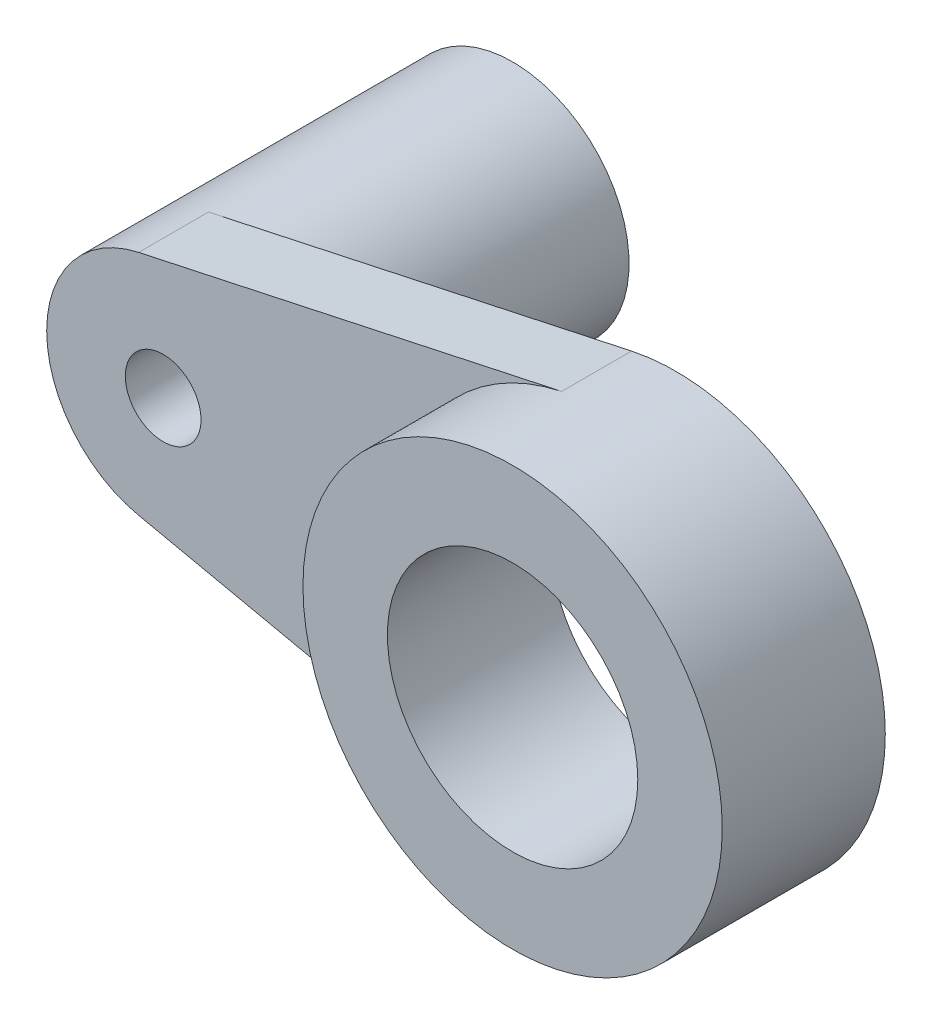
ISO-10303-21;
HEADER;
FILE_DESCRIPTION(('STEP AP214'),'2;1');
FILE_NAME('part.step','',(''),(''),'','','');
FILE_SCHEMA(('AUTOMOTIVE_DESIGN { 1 0 10303 214 1 1 1 1 }'));
ENDSEC;
DATA;
#1=APPLICATION_CONTEXT('core data for automotive mechanical design processes');
#2=APPLICATION_PROTOCOL_DEFINITION('international standard','automotive_design',2000,#1);
#3=PRODUCT_CONTEXT('',#1,'mechanical');
#4=PRODUCT('Part','Part','',(#3));
#5=PRODUCT_RELATED_PRODUCT_CATEGORY('part','',(#4));
#6=PRODUCT_DEFINITION_FORMATION('','',#4);
#7=PRODUCT_DEFINITION_CONTEXT('part definition',#1,'design');
#8=PRODUCT_DEFINITION('design','',#6,#7);
#9=PRODUCT_DEFINITION_SHAPE('','',#8);
#10=(LENGTH_UNIT() NAMED_UNIT(*) SI_UNIT(.MILLI.,.METRE.));
#11=(NAMED_UNIT(*) PLANE_ANGLE_UNIT() SI_UNIT($,.RADIAN.));
#12=(NAMED_UNIT(*) SI_UNIT($,.STERADIAN.) SOLID_ANGLE_UNIT());
#13=UNCERTAINTY_MEASURE_WITH_UNIT(LENGTH_MEASURE(1.E-05),#10,'distance_accuracy_value','');
#14=(GEOMETRIC_REPRESENTATION_CONTEXT(3) GLOBAL_UNCERTAINTY_ASSIGNED_CONTEXT((#13)) GLOBAL_UNIT_ASSIGNED_CONTEXT((#10,
#11,#12)) REPRESENTATION_CONTEXT('',''));
#15=CARTESIAN_POINT('',(0.,0.,0.));
#16=DIRECTION('',(0.,0.,1.));
#17=DIRECTION('',(1.,0.,0.));
#18=AXIS2_PLACEMENT_3D('',#15,#16,#17);
#19=CARTESIAN_POINT('',(0.,0.,0.));
#20=DIRECTION('',(0.,0.,1.));
#21=DIRECTION('',(1.,0.,0.));
#22=AXIS2_PLACEMENT_3D('',#19,#20,#21);
#23=PLANE('',#22);
#24=CARTESIAN_POINT('',(0.,0.,0.));
#25=DIRECTION('',(0.,0.,1.));
#26=DIRECTION('',(1.,0.,0.));
#27=AXIS2_PLACEMENT_3D('',#24,#25,#26);
#28=CIRCLE('',#27,10.75);
#29=CARTESIAN_POINT('',(10.75,0.,0.));
#30=VERTEX_POINT('',#29);
#31=EDGE_CURVE('E148',#30,#30,#28,.T.);
#32=ORIENTED_EDGE('',*,*,#31,.T.);
#33=EDGE_LOOP('',(#32));
#34=FACE_BOUND('',#33,.T.);
#35=CARTESIAN_POINT('',(-38.,0.,0.));
#36=DIRECTION('',(0.,0.,-1.));
#37=DIRECTION('',(-1.,0.,0.));
#38=AXIS2_PLACEMENT_3D('',#35,#36,#37);
#39=CIRCLE('',#38,10.);
#40=CARTESIAN_POINT('',(-40.1052631578947,9.77588190579301,0.));
#41=VERTEX_POINT('',#40);
#42=CARTESIAN_POINT('',(-40.1052631578947,-9.77588190579301,0.));
#43=VERTEX_POINT('',#42);
#44=EDGE_CURVE('E110',#41,#43,#39,.T.);
#45=ORIENTED_EDGE('',*,*,#44,.F.);
#46=DIRECTION('',(0.977588190579301,0.210526315789474,0.));
#47=VECTOR('',#46,1.);
#48=CARTESIAN_POINT('',(-3.78947368421052,17.5965874304274,0.));
#49=LINE('',#48,#47);
#50=CARTESIAN_POINT('',(-3.78947368421053,17.5965874304274,0.));
#51=VERTEX_POINT('',#50);
#52=EDGE_CURVE('E93',#41,#51,#49,.T.);
#53=ORIENTED_EDGE('',*,*,#52,.T.);
#54=CARTESIAN_POINT('',(0.,0.,0.));
#55=DIRECTION('',(0.,0.,1.));
#56=DIRECTION('',(1.,0.,0.));
#57=AXIS2_PLACEMENT_3D('',#54,#55,#56);
#58=CIRCLE('',#57,18.);
#59=CARTESIAN_POINT('',(-3.78947368421053,-17.5965874304274,0.));
#60=VERTEX_POINT('',#59);
#61=EDGE_CURVE('E57',#60,#51,#58,.T.);
#62=ORIENTED_EDGE('',*,*,#61,.F.);
#63=DIRECTION('',(-0.977588190579301,0.210526315789474,0.));
#64=VECTOR('',#63,1.);
#65=CARTESIAN_POINT('',(-3.78947368421052,-17.5965874304274,0.));
#66=LINE('',#65,#64);
#67=EDGE_CURVE('E103',#60,#43,#66,.T.);
#68=ORIENTED_EDGE('',*,*,#67,.T.);
#69=EDGE_LOOP('',(#45,#53,#62,#68));
#70=FACE_BOUND('',#69,.T.);
#71=ADVANCED_FACE('F53',(#34,#70),#23,.F.);
#72=CARTESIAN_POINT('',(0.,0.,14.));
#73=DIRECTION('',(0.,0.,1.));
#74=DIRECTION('',(1.,0.,0.));
#75=AXIS2_PLACEMENT_3D('',#72,#73,#74);
#76=PLANE('',#75);
#77=CARTESIAN_POINT('',(0.,0.,14.));
#78=DIRECTION('',(0.,0.,1.));
#79=DIRECTION('',(1.,0.,0.));
#80=AXIS2_PLACEMENT_3D('',#77,#78,#79);
#81=CIRCLE('',#80,18.);
#82=CARTESIAN_POINT('',(18.,0.,14.));
#83=VERTEX_POINT('',#82);
#84=EDGE_CURVE('E12',#83,#83,#81,.T.);
#85=ORIENTED_EDGE('',*,*,#84,.T.);
#86=EDGE_LOOP('',(#85));
#87=FACE_BOUND('',#86,.T.);
#88=CARTESIAN_POINT('',(0.,0.,14.));
#89=DIRECTION('',(0.,0.,1.));
#90=DIRECTION('',(1.,0.,0.));
#91=AXIS2_PLACEMENT_3D('',#88,#89,#90);
#92=CIRCLE('',#91,10.75);
#93=CARTESIAN_POINT('',(10.75,0.,14.));
#94=VERTEX_POINT('',#93);
#95=EDGE_CURVE('E153',#94,#94,#92,.T.);
#96=ORIENTED_EDGE('',*,*,#95,.F.);
#97=EDGE_LOOP('',(#96));
#98=FACE_BOUND('',#97,.T.);
#99=ADVANCED_FACE('F174',(#87,#98),#76,.T.);
#100=CARTESIAN_POINT('',(0.,0.,14.));
#101=DIRECTION('',(0.,0.,-1.));
#102=DIRECTION('',(-1.,0.,0.));
#103=AXIS2_PLACEMENT_3D('',#100,#101,#102);
#104=CYLINDRICAL_SURFACE('',#103,18.);
#105=CARTESIAN_POINT('',(0.,0.,6.));
#106=DIRECTION('',(0.,0.,-1.));
#107=DIRECTION('',(-1.,0.,0.));
#108=AXIS2_PLACEMENT_3D('',#105,#106,#107);
#109=CIRCLE('',#108,18.);
#110=CARTESIAN_POINT('',(-3.78947368421053,-17.5965874304274,6.));
#111=VERTEX_POINT('',#110);
#112=CARTESIAN_POINT('',(-3.78947368421053,17.5965874304274,6.));
#113=VERTEX_POINT('',#112);
#114=EDGE_CURVE('E73',#111,#113,#109,.T.);
#115=ORIENTED_EDGE('',*,*,#114,.F.);
#116=DIRECTION('',(0.,0.,-1.));
#117=VECTOR('',#116,1.);
#118=CARTESIAN_POINT('',(-3.78947368421053,-17.5965874304274,6.));
#119=LINE('',#118,#117);
#120=EDGE_CURVE('E145',#111,#60,#119,.T.);
#121=ORIENTED_EDGE('',*,*,#120,.T.);
#122=ORIENTED_EDGE('',*,*,#61,.T.);
#123=DIRECTION('',(0.,0.,-1.));
#124=VECTOR('',#123,1.);
#125=CARTESIAN_POINT('',(-3.78947368421053,17.5965874304274,6.));
#126=LINE('',#125,#124);
#127=EDGE_CURVE('E69',#113,#51,#126,.T.);
#128=ORIENTED_EDGE('',*,*,#127,.F.);
#129=EDGE_LOOP('',(#115,#121,#122,#128));
#130=FACE_BOUND('',#129,.T.);
#131=ORIENTED_EDGE('',*,*,#84,.F.);
#132=EDGE_LOOP('',(#131));
#133=FACE_BOUND('',#132,.T.);
#134=ADVANCED_FACE('F55',(#130,#133),#104,.T.);
#135=CARTESIAN_POINT('',(0.,0.,14.));
#136=DIRECTION('',(0.,0.,-1.));
#137=DIRECTION('',(-1.,0.,0.));
#138=AXIS2_PLACEMENT_3D('',#135,#136,#137);
#139=CYLINDRICAL_SURFACE('',#138,10.75);
#140=ORIENTED_EDGE('',*,*,#95,.T.);
#141=EDGE_LOOP('',(#140));
#142=FACE_BOUND('',#141,.T.);
#143=ORIENTED_EDGE('',*,*,#31,.F.);
#144=EDGE_LOOP('',(#143));
#145=FACE_BOUND('',#144,.T.);
#146=ADVANCED_FACE('F162',(#142,#145),#139,.F.);
#147=CARTESIAN_POINT('',(-3.78947368421052,-17.5965874304274,6.));
#148=DIRECTION('',(-0.210526315789474,-0.977588190579301,0.));
#149=DIRECTION('',(0.977588190579301,-0.210526315789474,0.));
#150=AXIS2_PLACEMENT_3D('',#147,#148,#149);
#151=PLANE('',#150);
#152=ORIENTED_EDGE('',*,*,#67,.F.);
#153=ORIENTED_EDGE('',*,*,#120,.F.);
#154=DIRECTION('',(-0.977588190579301,0.210526315789474,0.));
#155=VECTOR('',#154,1.);
#156=CARTESIAN_POINT('',(-3.78947368421052,-17.5965874304274,6.));
#157=LINE('',#156,#155);
#158=CARTESIAN_POINT('',(-40.1052631578947,-9.77588190579301,6.));
#159=VERTEX_POINT('',#158);
#160=EDGE_CURVE('E132',#111,#159,#157,.T.);
#161=ORIENTED_EDGE('',*,*,#160,.T.);
#162=DIRECTION('',(0.,0.,-1.));
#163=VECTOR('',#162,1.);
#164=CARTESIAN_POINT('',(-40.1052631578947,-9.77588190579301,6.));
#165=LINE('',#164,#163);
#166=EDGE_CURVE('E114',#159,#43,#165,.T.);
#167=ORIENTED_EDGE('',*,*,#166,.T.);
#168=EDGE_LOOP('',(#152,#153,#161,#167));
#169=FACE_BOUND('',#168,.T.);
#170=ADVANCED_FACE('F164',(#169),#151,.T.);
#171=CARTESIAN_POINT('',(-3.78947368421052,17.5965874304274,6.));
#172=DIRECTION('',(-0.210526315789474,0.977588190579301,0.));
#173=DIRECTION('',(-0.977588190579301,-0.210526315789474,0.));
#174=AXIS2_PLACEMENT_3D('',#171,#172,#173);
#175=PLANE('',#174);
#176=ORIENTED_EDGE('',*,*,#52,.F.);
#177=DIRECTION('',(0.,0.,-1.));
#178=VECTOR('',#177,1.);
#179=CARTESIAN_POINT('',(-40.1052631578947,9.775881905793,6.));
#180=LINE('',#179,#178);
#181=CARTESIAN_POINT('',(-40.1052631578947,9.775881905793,6.));
#182=VERTEX_POINT('',#181);
#183=EDGE_CURVE('E97',#182,#41,#180,.T.);
#184=ORIENTED_EDGE('',*,*,#183,.F.);
#185=DIRECTION('',(0.977588190579301,0.210526315789474,0.));
#186=VECTOR('',#185,1.);
#187=CARTESIAN_POINT('',(-3.78947368421052,17.5965874304274,6.));
#188=LINE('',#187,#186);
#189=EDGE_CURVE('E138',#182,#113,#188,.T.);
#190=ORIENTED_EDGE('',*,*,#189,.T.);
#191=ORIENTED_EDGE('',*,*,#127,.T.);
#192=EDGE_LOOP('',(#176,#184,#190,#191));
#193=FACE_BOUND('',#192,.T.);
#194=ADVANCED_FACE('F95',(#193),#175,.T.);
#195=CARTESIAN_POINT('',(-38.,0.,6.));
#196=DIRECTION('',(0.,0.,-1.));
#197=DIRECTION('',(-1.,0.,0.));
#198=AXIS2_PLACEMENT_3D('',#195,#196,#197);
#199=CYLINDRICAL_SURFACE('',#198,3.25);
#200=CARTESIAN_POINT('',(-38.,0.,6.));
#201=DIRECTION('',(0.,0.,-1.));
#202=DIRECTION('',(-1.,0.,0.));
#203=AXIS2_PLACEMENT_3D('',#200,#201,#202);
#204=CIRCLE('',#203,3.25);
#205=CARTESIAN_POINT('',(-41.25,0.,6.));
#206=VERTEX_POINT('',#205);
#207=EDGE_CURVE('E102',#206,#206,#204,.T.);
#208=ORIENTED_EDGE('',*,*,#207,.F.);
#209=EDGE_LOOP('',(#208));
#210=FACE_BOUND('',#209,.T.);
#211=CARTESIAN_POINT('',(-38.,0.,-24.));
#212=DIRECTION('',(0.,0.,-1.));
#213=DIRECTION('',(-1.,0.,0.));
#214=AXIS2_PLACEMENT_3D('',#211,#212,#213);
#215=CIRCLE('',#214,3.25);
#216=CARTESIAN_POINT('',(-41.25,0.,-24.));
#217=VERTEX_POINT('',#216);
#218=EDGE_CURVE('E120',#217,#217,#215,.T.);
#219=ORIENTED_EDGE('',*,*,#218,.T.);
#220=EDGE_LOOP('',(#219));
#221=FACE_BOUND('',#220,.T.);
#222=ADVANCED_FACE('F215',(#210,#221),#199,.F.);
#223=CARTESIAN_POINT('',(-38.,0.,6.));
#224=DIRECTION('',(0.,0.,-1.));
#225=DIRECTION('',(-1.,0.,0.));
#226=AXIS2_PLACEMENT_3D('',#223,#224,#225);
#227=CYLINDRICAL_SURFACE('',#226,10.);
#228=ORIENTED_EDGE('',*,*,#183,.T.);
#229=ORIENTED_EDGE('',*,*,#44,.T.);
#230=ORIENTED_EDGE('',*,*,#166,.F.);
#231=CARTESIAN_POINT('',(-38.,0.,6.));
#232=DIRECTION('',(0.,0.,-1.));
#233=DIRECTION('',(-1.,0.,0.));
#234=AXIS2_PLACEMENT_3D('',#231,#232,#233);
#235=CIRCLE('',#234,10.);
#236=EDGE_CURVE('E112',#159,#182,#235,.T.);
#237=ORIENTED_EDGE('',*,*,#236,.T.);
#238=EDGE_LOOP('',(#228,#229,#230,#237));
#239=FACE_BOUND('',#238,.T.);
#240=CARTESIAN_POINT('',(-38.,0.,-24.));
#241=DIRECTION('',(0.,0.,-1.));
#242=DIRECTION('',(-1.,0.,0.));
#243=AXIS2_PLACEMENT_3D('',#240,#241,#242);
#244=CIRCLE('',#243,10.);
#245=CARTESIAN_POINT('',(-48.,0.,-24.));
#246=VERTEX_POINT('',#245);
#247=EDGE_CURVE('E119',#246,#246,#244,.T.);
#248=ORIENTED_EDGE('',*,*,#247,.F.);
#249=EDGE_LOOP('',(#248));
#250=FACE_BOUND('',#249,.T.);
#251=ADVANCED_FACE('F108',(#239,#250),#227,.T.);
#252=CARTESIAN_POINT('',(0.,0.,6.));
#253=DIRECTION('',(0.,0.,-1.));
#254=DIRECTION('',(-1.,0.,0.));
#255=AXIS2_PLACEMENT_3D('',#252,#253,#254);
#256=PLANE('',#255);
#257=ORIENTED_EDGE('',*,*,#207,.T.);
#258=EDGE_LOOP('',(#257));
#259=FACE_BOUND('',#258,.T.);
#260=ORIENTED_EDGE('',*,*,#160,.F.);
#261=ORIENTED_EDGE('',*,*,#114,.T.);
#262=ORIENTED_EDGE('',*,*,#189,.F.);
#263=ORIENTED_EDGE('',*,*,#236,.F.);
#264=EDGE_LOOP('',(#260,#261,#262,#263));
#265=FACE_BOUND('',#264,.T.);
#266=ADVANCED_FACE('F235',(#259,#265),#256,.F.);
#267=CARTESIAN_POINT('',(-38.,0.,-24.));
#268=DIRECTION('',(0.,0.,-1.));
#269=DIRECTION('',(-1.,0.,0.));
#270=AXIS2_PLACEMENT_3D('',#267,#268,#269);
#271=PLANE('',#270);
#272=ORIENTED_EDGE('',*,*,#247,.T.);
#273=EDGE_LOOP('',(#272));
#274=FACE_BOUND('',#273,.T.);
#275=ORIENTED_EDGE('',*,*,#218,.F.);
#276=EDGE_LOOP('',(#275));
#277=FACE_BOUND('',#276,.T.);
#278=ADVANCED_FACE('F245',(#274,#277),#271,.T.);
#279=CLOSED_SHELL('',(#71,#99,#134,#146,#170,#194,#222,#251,#266,#278));
#280=MANIFOLD_SOLID_BREP('B2',#279);
#281=ADVANCED_BREP_SHAPE_REPRESENTATION('',(#18,#280),#14);
#282=SHAPE_DEFINITION_REPRESENTATION(#9,#281);
ENDSEC;
END-ISO-10303-21;
